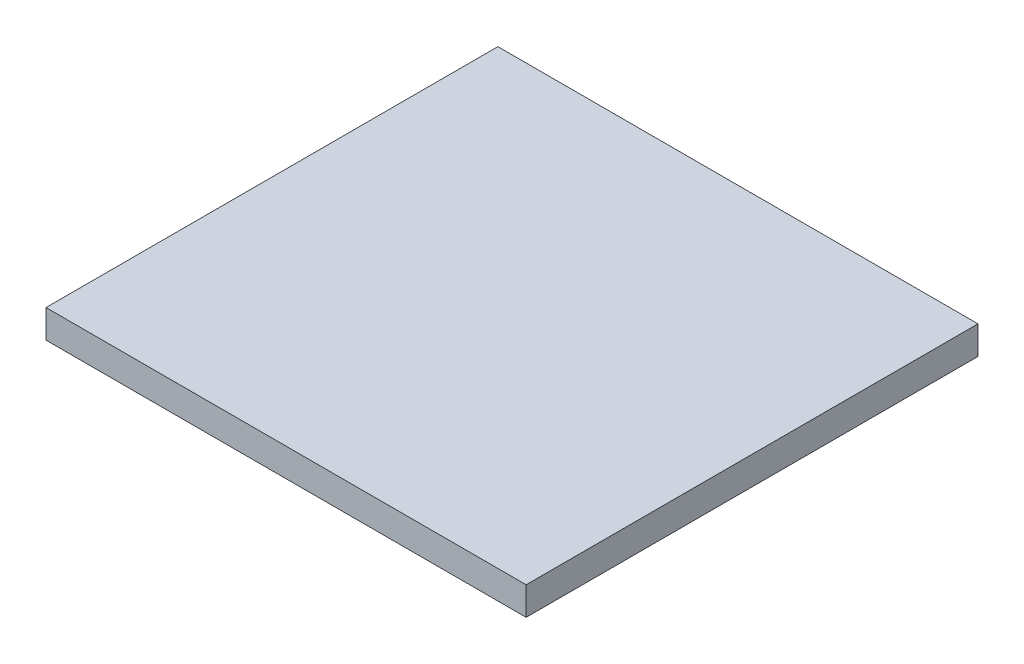
ISO-10303-21;
HEADER;
FILE_DESCRIPTION(('STEP AP214'),'2;1');
FILE_NAME('part.step','',(''),(''),'','','');
FILE_SCHEMA(('AUTOMOTIVE_DESIGN { 1 0 10303 214 1 1 1 1 }'));
ENDSEC;
DATA;
#1=APPLICATION_CONTEXT('core data for automotive mechanical design processes');
#2=APPLICATION_PROTOCOL_DEFINITION('international standard','automotive_design',2000,#1);
#3=PRODUCT_CONTEXT('',#1,'mechanical');
#4=PRODUCT('Part','Part','',(#3));
#5=PRODUCT_RELATED_PRODUCT_CATEGORY('part','',(#4));
#6=PRODUCT_DEFINITION_FORMATION('','',#4);
#7=PRODUCT_DEFINITION_CONTEXT('part definition',#1,'design');
#8=PRODUCT_DEFINITION('design','',#6,#7);
#9=PRODUCT_DEFINITION_SHAPE('','',#8);
#10=(LENGTH_UNIT() NAMED_UNIT(*) SI_UNIT(.MILLI.,.METRE.));
#11=(NAMED_UNIT(*) PLANE_ANGLE_UNIT() SI_UNIT($,.RADIAN.));
#12=(NAMED_UNIT(*) SI_UNIT($,.STERADIAN.) SOLID_ANGLE_UNIT());
#13=UNCERTAINTY_MEASURE_WITH_UNIT(LENGTH_MEASURE(1.E-05),#10,'distance_accuracy_value','');
#14=(GEOMETRIC_REPRESENTATION_CONTEXT(3) GLOBAL_UNCERTAINTY_ASSIGNED_CONTEXT((#13)) GLOBAL_UNIT_ASSIGNED_CONTEXT((#10,
#11,#12)) REPRESENTATION_CONTEXT('',''));
#15=CARTESIAN_POINT('',(0.,0.,0.));
#16=DIRECTION('',(0.,0.,1.));
#17=DIRECTION('',(1.,0.,0.));
#18=AXIS2_PLACEMENT_3D('',#15,#16,#17);
#19=CARTESIAN_POINT('',(17.,2.,-16.));
#20=DIRECTION('',(-1.,0.,0.));
#21=DIRECTION('',(0.,0.,1.));
#22=AXIS2_PLACEMENT_3D('',#19,#20,#21);
#23=PLANE('',#22);
#24=DIRECTION('',(0.,0.,-1.));
#25=VECTOR('',#24,1.);
#26=CARTESIAN_POINT('',(17.,0.,-16.));
#27=LINE('',#26,#25);
#28=CARTESIAN_POINT('',(17.,0.,16.));
#29=VERTEX_POINT('',#28);
#30=CARTESIAN_POINT('',(17.,0.,-16.));
#31=VERTEX_POINT('',#30);
#32=EDGE_CURVE('E96',#29,#31,#27,.T.);
#33=ORIENTED_EDGE('',*,*,#32,.T.);
#34=DIRECTION('',(0.,-1.,0.));
#35=VECTOR('',#34,1.);
#36=CARTESIAN_POINT('',(17.,2.,-16.));
#37=LINE('',#36,#35);
#38=CARTESIAN_POINT('',(17.,2.,-16.));
#39=VERTEX_POINT('',#38);
#40=EDGE_CURVE('E11',#39,#31,#37,.T.);
#41=ORIENTED_EDGE('',*,*,#40,.F.);
#42=DIRECTION('',(0.,0.,-1.));
#43=VECTOR('',#42,1.);
#44=CARTESIAN_POINT('',(17.,2.,-16.));
#45=LINE('',#44,#43);
#46=CARTESIAN_POINT('',(17.,2.,16.));
#47=VERTEX_POINT('',#46);
#48=EDGE_CURVE('E84',#47,#39,#45,.T.);
#49=ORIENTED_EDGE('',*,*,#48,.F.);
#50=DIRECTION('',(0.,-1.,0.));
#51=VECTOR('',#50,1.);
#52=CARTESIAN_POINT('',(17.,2.,16.));
#53=LINE('',#52,#51);
#54=EDGE_CURVE('E92',#47,#29,#53,.T.);
#55=ORIENTED_EDGE('',*,*,#54,.T.);
#56=EDGE_LOOP('',(#33,#41,#49,#55));
#57=FACE_BOUND('',#56,.T.);
#58=ADVANCED_FACE('F33',(#57),#23,.F.);
#59=CARTESIAN_POINT('',(-17.,2.,-16.));
#60=DIRECTION('',(0.,0.,1.));
#61=DIRECTION('',(1.,0.,0.));
#62=AXIS2_PLACEMENT_3D('',#59,#60,#61);
#63=PLANE('',#62);
#64=DIRECTION('',(-1.,0.,0.));
#65=VECTOR('',#64,1.);
#66=CARTESIAN_POINT('',(-17.,0.,-16.));
#67=LINE('',#66,#65);
#68=CARTESIAN_POINT('',(-17.,0.,-16.));
#69=VERTEX_POINT('',#68);
#70=EDGE_CURVE('E88',#31,#69,#67,.T.);
#71=ORIENTED_EDGE('',*,*,#70,.T.);
#72=DIRECTION('',(0.,-1.,0.));
#73=VECTOR('',#72,1.);
#74=CARTESIAN_POINT('',(-17.,2.,-16.));
#75=LINE('',#74,#73);
#76=CARTESIAN_POINT('',(-17.,2.,-16.));
#77=VERTEX_POINT('',#76);
#78=EDGE_CURVE('E41',#77,#69,#75,.T.);
#79=ORIENTED_EDGE('',*,*,#78,.F.);
#80=DIRECTION('',(-1.,0.,0.));
#81=VECTOR('',#80,1.);
#82=CARTESIAN_POINT('',(-17.,2.,-16.));
#83=LINE('',#82,#81);
#84=EDGE_CURVE('E79',#39,#77,#83,.T.);
#85=ORIENTED_EDGE('',*,*,#84,.F.);
#86=ORIENTED_EDGE('',*,*,#40,.T.);
#87=EDGE_LOOP('',(#71,#79,#85,#86));
#88=FACE_BOUND('',#87,.T.);
#89=ADVANCED_FACE('F87',(#88),#63,.F.);
#90=CARTESIAN_POINT('',(-17.,2.,-16.));
#91=DIRECTION('',(1.,0.,0.));
#92=DIRECTION('',(0.,0.,-1.));
#93=AXIS2_PLACEMENT_3D('',#90,#91,#92);
#94=PLANE('',#93);
#95=DIRECTION('',(0.,0.,1.));
#96=VECTOR('',#95,1.);
#97=CARTESIAN_POINT('',(-17.,0.,-16.));
#98=LINE('',#97,#96);
#99=CARTESIAN_POINT('',(-17.,0.,16.));
#100=VERTEX_POINT('',#99);
#101=EDGE_CURVE('E66',#69,#100,#98,.T.);
#102=ORIENTED_EDGE('',*,*,#101,.T.);
#103=DIRECTION('',(0.,-1.,0.));
#104=VECTOR('',#103,1.);
#105=CARTESIAN_POINT('',(-17.,2.,16.));
#106=LINE('',#105,#104);
#107=CARTESIAN_POINT('',(-17.,2.,16.));
#108=VERTEX_POINT('',#107);
#109=EDGE_CURVE('E89',#108,#100,#106,.T.);
#110=ORIENTED_EDGE('',*,*,#109,.F.);
#111=DIRECTION('',(0.,0.,1.));
#112=VECTOR('',#111,1.);
#113=CARTESIAN_POINT('',(-17.,2.,-16.));
#114=LINE('',#113,#112);
#115=EDGE_CURVE('E82',#77,#108,#114,.T.);
#116=ORIENTED_EDGE('',*,*,#115,.F.);
#117=ORIENTED_EDGE('',*,*,#78,.T.);
#118=EDGE_LOOP('',(#102,#110,#116,#117));
#119=FACE_BOUND('',#118,.T.);
#120=ADVANCED_FACE('F90',(#119),#94,.F.);
#121=CARTESIAN_POINT('',(-17.,2.,16.));
#122=DIRECTION('',(0.,0.,-1.));
#123=DIRECTION('',(-1.,0.,0.));
#124=AXIS2_PLACEMENT_3D('',#121,#122,#123);
#125=PLANE('',#124);
#126=DIRECTION('',(1.,0.,0.));
#127=VECTOR('',#126,1.);
#128=CARTESIAN_POINT('',(-17.,0.,16.));
#129=LINE('',#128,#127);
#130=EDGE_CURVE('E72',#100,#29,#129,.T.);
#131=ORIENTED_EDGE('',*,*,#130,.T.);
#132=ORIENTED_EDGE('',*,*,#54,.F.);
#133=DIRECTION('',(1.,0.,0.));
#134=VECTOR('',#133,1.);
#135=CARTESIAN_POINT('',(-17.,2.,16.));
#136=LINE('',#135,#134);
#137=EDGE_CURVE('E49',#108,#47,#136,.T.);
#138=ORIENTED_EDGE('',*,*,#137,.F.);
#139=ORIENTED_EDGE('',*,*,#109,.T.);
#140=EDGE_LOOP('',(#131,#132,#138,#139));
#141=FACE_BOUND('',#140,.T.);
#142=ADVANCED_FACE('F103',(#141),#125,.F.);
#143=CARTESIAN_POINT('',(0.,2.,0.));
#144=DIRECTION('',(0.,1.,0.));
#145=DIRECTION('',(0.,0.,1.));
#146=AXIS2_PLACEMENT_3D('',#143,#144,#145);
#147=PLANE('',#146);
#148=ORIENTED_EDGE('',*,*,#48,.T.);
#149=ORIENTED_EDGE('',*,*,#84,.T.);
#150=ORIENTED_EDGE('',*,*,#115,.T.);
#151=ORIENTED_EDGE('',*,*,#137,.T.);
#152=EDGE_LOOP('',(#148,#149,#150,#151));
#153=FACE_BOUND('',#152,.T.);
#154=ADVANCED_FACE('F80',(#153),#147,.T.);
#155=CARTESIAN_POINT('',(0.,0.,0.));
#156=DIRECTION('',(0.,1.,0.));
#157=DIRECTION('',(0.,0.,1.));
#158=AXIS2_PLACEMENT_3D('',#155,#156,#157);
#159=PLANE('',#158);
#160=ORIENTED_EDGE('',*,*,#32,.F.);
#161=ORIENTED_EDGE('',*,*,#130,.F.);
#162=ORIENTED_EDGE('',*,*,#101,.F.);
#163=ORIENTED_EDGE('',*,*,#70,.F.);
#164=EDGE_LOOP('',(#160,#161,#162,#163));
#165=FACE_BOUND('',#164,.T.);
#166=ADVANCED_FACE('F106',(#165),#159,.F.);
#167=CLOSED_SHELL('',(#58,#89,#120,#142,#154,#166));
#168=MANIFOLD_SOLID_BREP('B2',#167);
#169=ADVANCED_BREP_SHAPE_REPRESENTATION('',(#18,#168),#14);
#170=SHAPE_DEFINITION_REPRESENTATION(#9,#169);
ENDSEC;
END-ISO-10303-21;
